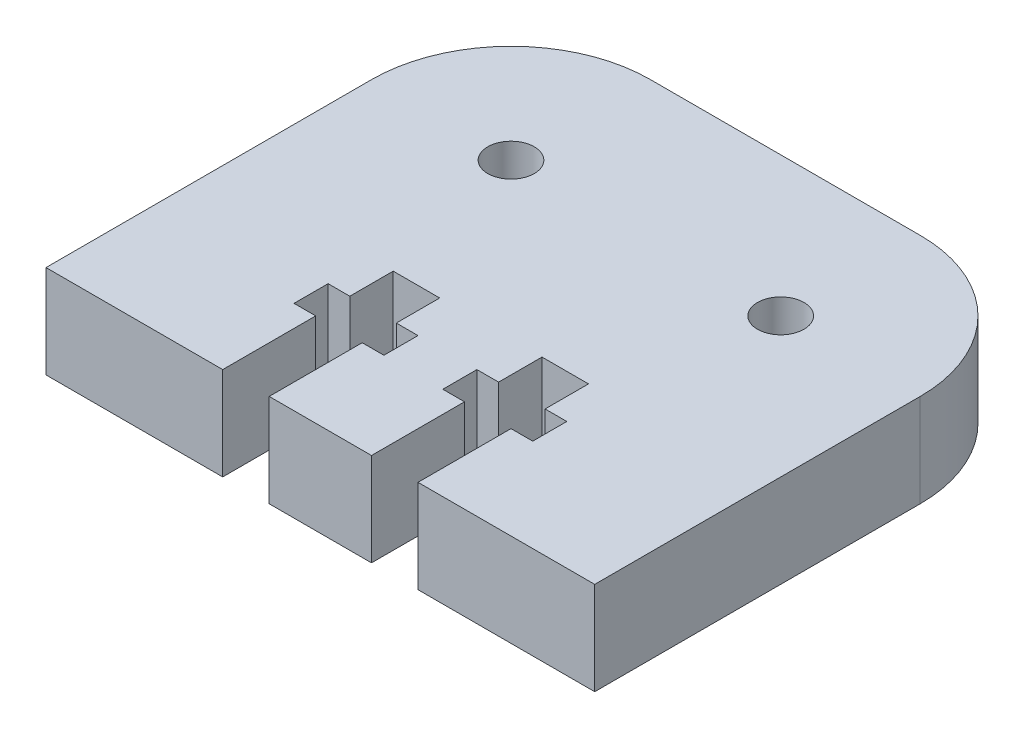
ISO-10303-21;
HEADER;
FILE_DESCRIPTION(('STEP AP214'),'2;1');
FILE_NAME('part.step','',(''),(''),'','','');
FILE_SCHEMA(('AUTOMOTIVE_DESIGN { 1 0 10303 214 1 1 1 1 }'));
ENDSEC;
DATA;
#1=APPLICATION_CONTEXT('core data for automotive mechanical design processes');
#2=APPLICATION_PROTOCOL_DEFINITION('international standard','automotive_design',2000,#1);
#3=PRODUCT_CONTEXT('',#1,'mechanical');
#4=PRODUCT('Part','Part','',(#3));
#5=PRODUCT_RELATED_PRODUCT_CATEGORY('part','',(#4));
#6=PRODUCT_DEFINITION_FORMATION('','',#4);
#7=PRODUCT_DEFINITION_CONTEXT('part definition',#1,'design');
#8=PRODUCT_DEFINITION('design','',#6,#7);
#9=PRODUCT_DEFINITION_SHAPE('','',#8);
#10=(LENGTH_UNIT() NAMED_UNIT(*) SI_UNIT(.MILLI.,.METRE.));
#11=(NAMED_UNIT(*) PLANE_ANGLE_UNIT() SI_UNIT($,.RADIAN.));
#12=(NAMED_UNIT(*) SI_UNIT($,.STERADIAN.) SOLID_ANGLE_UNIT());
#13=UNCERTAINTY_MEASURE_WITH_UNIT(LENGTH_MEASURE(1.E-05),#10,'distance_accuracy_value','');
#14=(GEOMETRIC_REPRESENTATION_CONTEXT(3) GLOBAL_UNCERTAINTY_ASSIGNED_CONTEXT((#13)) GLOBAL_UNIT_ASSIGNED_CONTEXT((#10,
#11,#12)) REPRESENTATION_CONTEXT('',''));
#15=CARTESIAN_POINT('',(0.,0.,0.));
#16=DIRECTION('',(0.,0.,1.));
#17=DIRECTION('',(1.,0.,0.));
#18=AXIS2_PLACEMENT_3D('',#15,#16,#17);
#19=CARTESIAN_POINT('',(0.,6.,0.));
#20=DIRECTION('',(0.,-1.,0.));
#21=DIRECTION('',(0.,0.,-1.));
#22=AXIS2_PLACEMENT_3D('',#19,#20,#21);
#23=PLANE('',#22);
#24=DIRECTION('',(0.,0.,1.));
#25=VECTOR('',#24,1.);
#26=CARTESIAN_POINT('',(17.7,6.,-15.));
#27=LINE('',#26,#25);
#28=CARTESIAN_POINT('',(17.7,6.,-6.));
#29=VERTEX_POINT('',#28);
#30=CARTESIAN_POINT('',(17.7,6.,15.));
#31=VERTEX_POINT('',#30);
#32=EDGE_CURVE('E229',#29,#31,#27,.T.);
#33=ORIENTED_EDGE('',*,*,#32,.F.);
#34=CARTESIAN_POINT('',(8.7,6.,-6.));
#35=DIRECTION('',(0.,-1.,0.));
#36=DIRECTION('',(0.,0.,-1.));
#37=AXIS2_PLACEMENT_3D('',#34,#35,#36);
#38=CIRCLE('',#37,9.);
#39=CARTESIAN_POINT('',(8.7,6.,-15.));
#40=VERTEX_POINT('',#39);
#41=EDGE_CURVE('E40',#29,#40,#38,.F.);
#42=ORIENTED_EDGE('',*,*,#41,.T.);
#43=DIRECTION('',(-1.,0.,0.));
#44=VECTOR('',#43,1.);
#45=CARTESIAN_POINT('',(-17.7,6.,-15.));
#46=LINE('',#45,#44);
#47=CARTESIAN_POINT('',(-8.70000000000001,6.,-15.));
#48=VERTEX_POINT('',#47);
#49=EDGE_CURVE('E354',#40,#48,#46,.T.);
#50=ORIENTED_EDGE('',*,*,#49,.T.);
#51=CARTESIAN_POINT('',(-8.70000000000001,6.,-6.));
#52=DIRECTION('',(0.,-1.,0.));
#53=DIRECTION('',(0.,0.,-1.));
#54=AXIS2_PLACEMENT_3D('',#51,#52,#53);
#55=CIRCLE('',#54,9.);
#56=CARTESIAN_POINT('',(-17.7,6.,-5.99999999999999));
#57=VERTEX_POINT('',#56);
#58=EDGE_CURVE('E47',#48,#57,#55,.F.);
#59=ORIENTED_EDGE('',*,*,#58,.T.);
#60=DIRECTION('',(0.,0.,1.));
#61=VECTOR('',#60,1.);
#62=CARTESIAN_POINT('',(-17.7,6.,-15.));
#63=LINE('',#62,#61);
#64=CARTESIAN_POINT('',(-17.7,6.,15.));
#65=VERTEX_POINT('',#64);
#66=EDGE_CURVE('E357',#57,#65,#63,.T.);
#67=ORIENTED_EDGE('',*,*,#66,.T.);
#68=DIRECTION('',(1.,0.,0.));
#69=VECTOR('',#68,1.);
#70=CARTESIAN_POINT('',(-17.7,6.,15.));
#71=LINE('',#70,#69);
#72=CARTESIAN_POINT('',(-6.3,6.,15.));
#73=VERTEX_POINT('',#72);
#74=EDGE_CURVE('E359',#65,#73,#71,.T.);
#75=ORIENTED_EDGE('',*,*,#74,.T.);
#76=DIRECTION('',(0.,0.,-1.));
#77=VECTOR('',#76,1.);
#78=CARTESIAN_POINT('',(-6.3,6.,9.));
#79=LINE('',#78,#77);
#80=CARTESIAN_POINT('',(-6.3,6.,9.));
#81=VERTEX_POINT('',#80);
#82=EDGE_CURVE('E361',#73,#81,#79,.T.);
#83=ORIENTED_EDGE('',*,*,#82,.T.);
#84=DIRECTION('',(-1.,0.,0.));
#85=VECTOR('',#84,1.);
#86=CARTESIAN_POINT('',(-7.7,6.,9.));
#87=LINE('',#86,#85);
#88=CARTESIAN_POINT('',(-7.7,6.,9.));
#89=VERTEX_POINT('',#88);
#90=EDGE_CURVE('E363',#81,#89,#87,.T.);
#91=ORIENTED_EDGE('',*,*,#90,.T.);
#92=DIRECTION('',(0.,0.,-1.));
#93=VECTOR('',#92,1.);
#94=CARTESIAN_POINT('',(-7.7,6.,9.));
#95=LINE('',#94,#93);
#96=CARTESIAN_POINT('',(-7.7,6.,6.8));
#97=VERTEX_POINT('',#96);
#98=EDGE_CURVE('E365',#89,#97,#95,.T.);
#99=ORIENTED_EDGE('',*,*,#98,.T.);
#100=DIRECTION('',(1.,0.,0.));
#101=VECTOR('',#100,1.);
#102=CARTESIAN_POINT('',(-7.7,6.,6.8));
#103=LINE('',#102,#101);
#104=CARTESIAN_POINT('',(-6.3,6.,6.8));
#105=VERTEX_POINT('',#104);
#106=EDGE_CURVE('E367',#97,#105,#103,.T.);
#107=ORIENTED_EDGE('',*,*,#106,.T.);
#108=DIRECTION('',(0.,0.,-1.));
#109=VECTOR('',#108,1.);
#110=CARTESIAN_POINT('',(-6.3,6.,4.));
#111=LINE('',#110,#109);
#112=CARTESIAN_POINT('',(-6.3,6.,4.));
#113=VERTEX_POINT('',#112);
#114=EDGE_CURVE('E369',#105,#113,#111,.T.);
#115=ORIENTED_EDGE('',*,*,#114,.T.);
#116=DIRECTION('',(1.,0.,0.));
#117=VECTOR('',#116,1.);
#118=CARTESIAN_POINT('',(-6.3,6.,4.));
#119=LINE('',#118,#117);
#120=CARTESIAN_POINT('',(-3.3,6.,4.));
#121=VERTEX_POINT('',#120);
#122=EDGE_CURVE('E371',#113,#121,#119,.T.);
#123=ORIENTED_EDGE('',*,*,#122,.T.);
#124=DIRECTION('',(0.,0.,1.));
#125=VECTOR('',#124,1.);
#126=CARTESIAN_POINT('',(-3.3,6.,4.));
#127=LINE('',#126,#125);
#128=CARTESIAN_POINT('',(-3.3,6.,6.8));
#129=VERTEX_POINT('',#128);
#130=EDGE_CURVE('E373',#121,#129,#127,.T.);
#131=ORIENTED_EDGE('',*,*,#130,.T.);
#132=DIRECTION('',(1.,0.,0.));
#133=VECTOR('',#132,1.);
#134=CARTESIAN_POINT('',(-3.3,6.,6.8));
#135=LINE('',#134,#133);
#136=CARTESIAN_POINT('',(-1.9,6.,6.8));
#137=VERTEX_POINT('',#136);
#138=EDGE_CURVE('E375',#129,#137,#135,.T.);
#139=ORIENTED_EDGE('',*,*,#138,.T.);
#140=DIRECTION('',(0.,0.,1.));
#141=VECTOR('',#140,1.);
#142=CARTESIAN_POINT('',(-1.9,6.,9.));
#143=LINE('',#142,#141);
#144=CARTESIAN_POINT('',(-1.9,6.,9.));
#145=VERTEX_POINT('',#144);
#146=EDGE_CURVE('E377',#137,#145,#143,.T.);
#147=ORIENTED_EDGE('',*,*,#146,.T.);
#148=DIRECTION('',(-1.,0.,0.));
#149=VECTOR('',#148,1.);
#150=CARTESIAN_POINT('',(-3.3,6.,9.));
#151=LINE('',#150,#149);
#152=CARTESIAN_POINT('',(-3.3,6.,9.));
#153=VERTEX_POINT('',#152);
#154=EDGE_CURVE('E379',#145,#153,#151,.T.);
#155=ORIENTED_EDGE('',*,*,#154,.T.);
#156=DIRECTION('',(0.,0.,1.));
#157=VECTOR('',#156,1.);
#158=CARTESIAN_POINT('',(-3.3,6.,9.));
#159=LINE('',#158,#157);
#160=CARTESIAN_POINT('',(-3.3,6.,15.));
#161=VERTEX_POINT('',#160);
#162=EDGE_CURVE('E381',#153,#161,#159,.T.);
#163=ORIENTED_EDGE('',*,*,#162,.T.);
#164=DIRECTION('',(1.,0.,0.));
#165=VECTOR('',#164,1.);
#166=CARTESIAN_POINT('',(-3.3,6.,15.));
#167=LINE('',#166,#165);
#168=CARTESIAN_POINT('',(3.30000000000001,6.,15.));
#169=VERTEX_POINT('',#168);
#170=EDGE_CURVE('E352',#161,#169,#167,.T.);
#171=ORIENTED_EDGE('',*,*,#170,.T.);
#172=DIRECTION('',(0.,0.,1.));
#173=VECTOR('',#172,1.);
#174=CARTESIAN_POINT('',(3.30000000000001,6.,9.));
#175=LINE('',#174,#173);
#176=CARTESIAN_POINT('',(3.30000000000001,6.,9.));
#177=VERTEX_POINT('',#176);
#178=EDGE_CURVE('E283',#177,#169,#175,.T.);
#179=ORIENTED_EDGE('',*,*,#178,.F.);
#180=DIRECTION('',(1.,0.,0.));
#181=VECTOR('',#180,1.);
#182=CARTESIAN_POINT('',(3.30000000000001,6.,9.));
#183=LINE('',#182,#181);
#184=CARTESIAN_POINT('',(1.90000000000001,6.,9.));
#185=VERTEX_POINT('',#184);
#186=EDGE_CURVE('E280',#185,#177,#183,.T.);
#187=ORIENTED_EDGE('',*,*,#186,.F.);
#188=DIRECTION('',(0.,0.,1.));
#189=VECTOR('',#188,1.);
#190=CARTESIAN_POINT('',(1.90000000000001,6.,9.));
#191=LINE('',#190,#189);
#192=CARTESIAN_POINT('',(1.90000000000001,6.,6.8));
#193=VERTEX_POINT('',#192);
#194=EDGE_CURVE('E277',#193,#185,#191,.T.);
#195=ORIENTED_EDGE('',*,*,#194,.F.);
#196=DIRECTION('',(-1.,0.,0.));
#197=VECTOR('',#196,1.);
#198=CARTESIAN_POINT('',(3.30000000000001,6.,6.8));
#199=LINE('',#198,#197);
#200=CARTESIAN_POINT('',(3.30000000000001,6.,6.8));
#201=VERTEX_POINT('',#200);
#202=EDGE_CURVE('E274',#201,#193,#199,.T.);
#203=ORIENTED_EDGE('',*,*,#202,.F.);
#204=DIRECTION('',(0.,0.,1.));
#205=VECTOR('',#204,1.);
#206=CARTESIAN_POINT('',(3.30000000000001,6.,4.));
#207=LINE('',#206,#205);
#208=CARTESIAN_POINT('',(3.30000000000001,6.,4.));
#209=VERTEX_POINT('',#208);
#210=EDGE_CURVE('E271',#209,#201,#207,.T.);
#211=ORIENTED_EDGE('',*,*,#210,.F.);
#212=DIRECTION('',(-1.,0.,0.));
#213=VECTOR('',#212,1.);
#214=CARTESIAN_POINT('',(6.30000000000001,6.,4.));
#215=LINE('',#214,#213);
#216=CARTESIAN_POINT('',(6.30000000000001,6.,4.));
#217=VERTEX_POINT('',#216);
#218=EDGE_CURVE('E268',#217,#209,#215,.T.);
#219=ORIENTED_EDGE('',*,*,#218,.F.);
#220=DIRECTION('',(0.,0.,-1.));
#221=VECTOR('',#220,1.);
#222=CARTESIAN_POINT('',(6.30000000000001,6.,4.));
#223=LINE('',#222,#221);
#224=CARTESIAN_POINT('',(6.30000000000001,6.,6.8));
#225=VERTEX_POINT('',#224);
#226=EDGE_CURVE('E265',#225,#217,#223,.T.);
#227=ORIENTED_EDGE('',*,*,#226,.F.);
#228=DIRECTION('',(-1.,0.,0.));
#229=VECTOR('',#228,1.);
#230=CARTESIAN_POINT('',(7.70000000000001,6.,6.8));
#231=LINE('',#230,#229);
#232=CARTESIAN_POINT('',(7.70000000000001,6.,6.8));
#233=VERTEX_POINT('',#232);
#234=EDGE_CURVE('E262',#233,#225,#231,.T.);
#235=ORIENTED_EDGE('',*,*,#234,.F.);
#236=DIRECTION('',(0.,0.,-1.));
#237=VECTOR('',#236,1.);
#238=CARTESIAN_POINT('',(7.70000000000001,6.,9.));
#239=LINE('',#238,#237);
#240=CARTESIAN_POINT('',(7.70000000000001,6.,9.));
#241=VERTEX_POINT('',#240);
#242=EDGE_CURVE('E259',#241,#233,#239,.T.);
#243=ORIENTED_EDGE('',*,*,#242,.F.);
#244=DIRECTION('',(1.,0.,0.));
#245=VECTOR('',#244,1.);
#246=CARTESIAN_POINT('',(7.70000000000001,6.,9.));
#247=LINE('',#246,#245);
#248=CARTESIAN_POINT('',(6.30000000000001,6.,9.));
#249=VERTEX_POINT('',#248);
#250=EDGE_CURVE('E253',#249,#241,#247,.T.);
#251=ORIENTED_EDGE('',*,*,#250,.F.);
#252=DIRECTION('',(0.,0.,-1.));
#253=VECTOR('',#252,1.);
#254=CARTESIAN_POINT('',(6.30000000000001,6.,9.));
#255=LINE('',#254,#253);
#256=CARTESIAN_POINT('',(6.30000000000001,6.,15.));
#257=VERTEX_POINT('',#256);
#258=EDGE_CURVE('E251',#257,#249,#255,.T.);
#259=ORIENTED_EDGE('',*,*,#258,.F.);
#260=DIRECTION('',(-1.,0.,0.));
#261=VECTOR('',#260,1.);
#262=CARTESIAN_POINT('',(17.7,6.,15.));
#263=LINE('',#262,#261);
#264=EDGE_CURVE('E236',#31,#257,#263,.T.);
#265=ORIENTED_EDGE('',*,*,#264,.F.);
#266=EDGE_LOOP('',(#33,#42,#50,#59,#67,#75,#83,#91,#99,#107,#115,#123,#131,#139,#147,#155,#163,
#171,#179,#187,#195,#203,#211,#219,#227,#235,#243,#251,#259,#265));
#267=FACE_BOUND('',#266,.T.);
#268=CARTESIAN_POINT('',(-8.7,6.,-6.));
#269=DIRECTION('',(0.,1.,0.));
#270=DIRECTION('',(0.,0.,1.));
#271=AXIS2_PLACEMENT_3D('',#268,#269,#270);
#272=CIRCLE('',#271,1.5);
#273=CARTESIAN_POINT('',(-8.7,6.,-4.49999999999999));
#274=VERTEX_POINT('',#273);
#275=EDGE_CURVE('E346',#274,#274,#272,.T.);
#276=ORIENTED_EDGE('',*,*,#275,.F.);
#277=EDGE_LOOP('',(#276));
#278=FACE_BOUND('',#277,.T.);
#279=CARTESIAN_POINT('',(8.7,6.,-6.));
#280=DIRECTION('',(0.,-1.,0.));
#281=DIRECTION('',(0.,0.,1.));
#282=AXIS2_PLACEMENT_3D('',#279,#280,#281);
#283=CIRCLE('',#282,1.5);
#284=CARTESIAN_POINT('',(8.7,6.,-4.5));
#285=VERTEX_POINT('',#284);
#286=EDGE_CURVE('E289',#285,#285,#283,.T.);
#287=ORIENTED_EDGE('',*,*,#286,.T.);
#288=EDGE_LOOP('',(#287));
#289=FACE_BOUND('',#288,.T.);
#290=ADVANCED_FACE('F32',(#267,#278,#289),#23,.F.);
#291=CARTESIAN_POINT('',(0.,0.,0.));
#292=DIRECTION('',(0.,-1.,0.));
#293=DIRECTION('',(0.,0.,-1.));
#294=AXIS2_PLACEMENT_3D('',#291,#292,#293);
#295=PLANE('',#294);
#296=DIRECTION('',(-1.,0.,0.));
#297=VECTOR('',#296,1.);
#298=CARTESIAN_POINT('',(-17.7,0.,-15.));
#299=LINE('',#298,#297);
#300=CARTESIAN_POINT('',(8.7,0.,-15.));
#301=VERTEX_POINT('',#300);
#302=CARTESIAN_POINT('',(-8.70000000000001,0.,-15.));
#303=VERTEX_POINT('',#302);
#304=EDGE_CURVE('E385',#301,#303,#299,.T.);
#305=ORIENTED_EDGE('',*,*,#304,.F.);
#306=CARTESIAN_POINT('',(8.7,0.,-6.));
#307=DIRECTION('',(0.,-1.,0.));
#308=DIRECTION('',(0.,0.,-1.));
#309=AXIS2_PLACEMENT_3D('',#306,#307,#308);
#310=CIRCLE('',#309,9.);
#311=CARTESIAN_POINT('',(17.7,0.,-6.));
#312=VERTEX_POINT('',#311);
#313=EDGE_CURVE('E458',#301,#312,#310,.T.);
#314=ORIENTED_EDGE('',*,*,#313,.T.);
#315=DIRECTION('',(0.,0.,1.));
#316=VECTOR('',#315,1.);
#317=CARTESIAN_POINT('',(17.7,0.,-15.));
#318=LINE('',#317,#316);
#319=CARTESIAN_POINT('',(17.7,0.,15.));
#320=VERTEX_POINT('',#319);
#321=EDGE_CURVE('E287',#312,#320,#318,.T.);
#322=ORIENTED_EDGE('',*,*,#321,.T.);
#323=DIRECTION('',(-1.,0.,0.));
#324=VECTOR('',#323,1.);
#325=CARTESIAN_POINT('',(17.7,0.,15.));
#326=LINE('',#325,#324);
#327=CARTESIAN_POINT('',(6.30000000000001,0.,15.));
#328=VERTEX_POINT('',#327);
#329=EDGE_CURVE('E244',#320,#328,#326,.T.);
#330=ORIENTED_EDGE('',*,*,#329,.T.);
#331=DIRECTION('',(0.,0.,-1.));
#332=VECTOR('',#331,1.);
#333=CARTESIAN_POINT('',(6.30000000000001,0.,9.));
#334=LINE('',#333,#332);
#335=CARTESIAN_POINT('',(6.30000000000001,0.,9.));
#336=VERTEX_POINT('',#335);
#337=EDGE_CURVE('E291',#328,#336,#334,.T.);
#338=ORIENTED_EDGE('',*,*,#337,.T.);
#339=DIRECTION('',(1.,0.,0.));
#340=VECTOR('',#339,1.);
#341=CARTESIAN_POINT('',(7.70000000000001,0.,9.));
#342=LINE('',#341,#340);
#343=CARTESIAN_POINT('',(7.70000000000001,0.,9.));
#344=VERTEX_POINT('',#343);
#345=EDGE_CURVE('E294',#336,#344,#342,.T.);
#346=ORIENTED_EDGE('',*,*,#345,.T.);
#347=DIRECTION('',(0.,0.,-1.));
#348=VECTOR('',#347,1.);
#349=CARTESIAN_POINT('',(7.70000000000001,0.,9.));
#350=LINE('',#349,#348);
#351=CARTESIAN_POINT('',(7.70000000000001,0.,6.8));
#352=VERTEX_POINT('',#351);
#353=EDGE_CURVE('E297',#344,#352,#350,.T.);
#354=ORIENTED_EDGE('',*,*,#353,.T.);
#355=DIRECTION('',(-1.,0.,0.));
#356=VECTOR('',#355,1.);
#357=CARTESIAN_POINT('',(7.70000000000001,0.,6.8));
#358=LINE('',#357,#356);
#359=CARTESIAN_POINT('',(6.30000000000001,0.,6.8));
#360=VERTEX_POINT('',#359);
#361=EDGE_CURVE('E300',#352,#360,#358,.T.);
#362=ORIENTED_EDGE('',*,*,#361,.T.);
#363=DIRECTION('',(0.,0.,-1.));
#364=VECTOR('',#363,1.);
#365=CARTESIAN_POINT('',(6.30000000000001,0.,4.));
#366=LINE('',#365,#364);
#367=CARTESIAN_POINT('',(6.30000000000001,0.,4.));
#368=VERTEX_POINT('',#367);
#369=EDGE_CURVE('E303',#360,#368,#366,.T.);
#370=ORIENTED_EDGE('',*,*,#369,.T.);
#371=DIRECTION('',(-1.,0.,0.));
#372=VECTOR('',#371,1.);
#373=CARTESIAN_POINT('',(6.30000000000001,0.,4.));
#374=LINE('',#373,#372);
#375=CARTESIAN_POINT('',(3.30000000000001,0.,4.));
#376=VERTEX_POINT('',#375);
#377=EDGE_CURVE('E306',#368,#376,#374,.T.);
#378=ORIENTED_EDGE('',*,*,#377,.T.);
#379=DIRECTION('',(0.,0.,1.));
#380=VECTOR('',#379,1.);
#381=CARTESIAN_POINT('',(3.30000000000001,0.,4.));
#382=LINE('',#381,#380);
#383=CARTESIAN_POINT('',(3.30000000000001,0.,6.8));
#384=VERTEX_POINT('',#383);
#385=EDGE_CURVE('E309',#376,#384,#382,.T.);
#386=ORIENTED_EDGE('',*,*,#385,.T.);
#387=DIRECTION('',(-1.,0.,0.));
#388=VECTOR('',#387,1.);
#389=CARTESIAN_POINT('',(3.30000000000001,0.,6.8));
#390=LINE('',#389,#388);
#391=CARTESIAN_POINT('',(1.90000000000001,0.,6.8));
#392=VERTEX_POINT('',#391);
#393=EDGE_CURVE('E312',#384,#392,#390,.T.);
#394=ORIENTED_EDGE('',*,*,#393,.T.);
#395=DIRECTION('',(0.,0.,1.));
#396=VECTOR('',#395,1.);
#397=CARTESIAN_POINT('',(1.90000000000001,0.,9.));
#398=LINE('',#397,#396);
#399=CARTESIAN_POINT('',(1.90000000000001,0.,9.));
#400=VERTEX_POINT('',#399);
#401=EDGE_CURVE('E315',#392,#400,#398,.T.);
#402=ORIENTED_EDGE('',*,*,#401,.T.);
#403=DIRECTION('',(1.,0.,0.));
#404=VECTOR('',#403,1.);
#405=CARTESIAN_POINT('',(3.30000000000001,0.,9.));
#406=LINE('',#405,#404);
#407=CARTESIAN_POINT('',(3.30000000000001,0.,9.));
#408=VERTEX_POINT('',#407);
#409=EDGE_CURVE('E318',#400,#408,#406,.T.);
#410=ORIENTED_EDGE('',*,*,#409,.T.);
#411=DIRECTION('',(0.,0.,1.));
#412=VECTOR('',#411,1.);
#413=CARTESIAN_POINT('',(3.30000000000001,0.,9.));
#414=LINE('',#413,#412);
#415=CARTESIAN_POINT('',(3.30000000000001,0.,15.));
#416=VERTEX_POINT('',#415);
#417=EDGE_CURVE('E237',#408,#416,#414,.T.);
#418=ORIENTED_EDGE('',*,*,#417,.T.);
#419=DIRECTION('',(1.,0.,0.));
#420=VECTOR('',#419,1.);
#421=CARTESIAN_POINT('',(-3.3,0.,15.));
#422=LINE('',#421,#420);
#423=CARTESIAN_POINT('',(-3.3,0.,15.));
#424=VERTEX_POINT('',#423);
#425=EDGE_CURVE('E349',#424,#416,#422,.T.);
#426=ORIENTED_EDGE('',*,*,#425,.F.);
#427=DIRECTION('',(0.,0.,1.));
#428=VECTOR('',#427,1.);
#429=CARTESIAN_POINT('',(-3.3,0.,9.));
#430=LINE('',#429,#428);
#431=CARTESIAN_POINT('',(-3.3,0.,9.));
#432=VERTEX_POINT('',#431);
#433=EDGE_CURVE('E355',#432,#424,#430,.T.);
#434=ORIENTED_EDGE('',*,*,#433,.F.);
#435=DIRECTION('',(-1.,0.,0.));
#436=VECTOR('',#435,1.);
#437=CARTESIAN_POINT('',(-3.3,0.,9.));
#438=LINE('',#437,#436);
#439=CARTESIAN_POINT('',(-1.9,0.,9.));
#440=VERTEX_POINT('',#439);
#441=EDGE_CURVE('E410',#440,#432,#438,.T.);
#442=ORIENTED_EDGE('',*,*,#441,.F.);
#443=DIRECTION('',(0.,0.,1.));
#444=VECTOR('',#443,1.);
#445=CARTESIAN_POINT('',(-1.9,0.,9.));
#446=LINE('',#445,#444);
#447=CARTESIAN_POINT('',(-1.9,0.,6.8));
#448=VERTEX_POINT('',#447);
#449=EDGE_CURVE('E408',#448,#440,#446,.T.);
#450=ORIENTED_EDGE('',*,*,#449,.F.);
#451=DIRECTION('',(1.,0.,0.));
#452=VECTOR('',#451,1.);
#453=CARTESIAN_POINT('',(-3.3,0.,6.8));
#454=LINE('',#453,#452);
#455=CARTESIAN_POINT('',(-3.3,0.,6.8));
#456=VERTEX_POINT('',#455);
#457=EDGE_CURVE('E406',#456,#448,#454,.T.);
#458=ORIENTED_EDGE('',*,*,#457,.F.);
#459=DIRECTION('',(0.,0.,1.));
#460=VECTOR('',#459,1.);
#461=CARTESIAN_POINT('',(-3.3,0.,4.));
#462=LINE('',#461,#460);
#463=CARTESIAN_POINT('',(-3.3,0.,4.));
#464=VERTEX_POINT('',#463);
#465=EDGE_CURVE('E404',#464,#456,#462,.T.);
#466=ORIENTED_EDGE('',*,*,#465,.F.);
#467=DIRECTION('',(1.,0.,0.));
#468=VECTOR('',#467,1.);
#469=CARTESIAN_POINT('',(-6.3,0.,4.));
#470=LINE('',#469,#468);
#471=CARTESIAN_POINT('',(-6.3,0.,4.));
#472=VERTEX_POINT('',#471);
#473=EDGE_CURVE('E402',#472,#464,#470,.T.);
#474=ORIENTED_EDGE('',*,*,#473,.F.);
#475=DIRECTION('',(0.,0.,-1.));
#476=VECTOR('',#475,1.);
#477=CARTESIAN_POINT('',(-6.3,0.,4.));
#478=LINE('',#477,#476);
#479=CARTESIAN_POINT('',(-6.3,0.,6.8));
#480=VERTEX_POINT('',#479);
#481=EDGE_CURVE('E400',#480,#472,#478,.T.);
#482=ORIENTED_EDGE('',*,*,#481,.F.);
#483=DIRECTION('',(1.,0.,0.));
#484=VECTOR('',#483,1.);
#485=CARTESIAN_POINT('',(-7.7,0.,6.8));
#486=LINE('',#485,#484);
#487=CARTESIAN_POINT('',(-7.7,0.,6.8));
#488=VERTEX_POINT('',#487);
#489=EDGE_CURVE('E398',#488,#480,#486,.T.);
#490=ORIENTED_EDGE('',*,*,#489,.F.);
#491=DIRECTION('',(0.,0.,-1.));
#492=VECTOR('',#491,1.);
#493=CARTESIAN_POINT('',(-7.7,0.,9.));
#494=LINE('',#493,#492);
#495=CARTESIAN_POINT('',(-7.7,0.,9.));
#496=VERTEX_POINT('',#495);
#497=EDGE_CURVE('E396',#496,#488,#494,.T.);
#498=ORIENTED_EDGE('',*,*,#497,.F.);
#499=DIRECTION('',(-1.,0.,0.));
#500=VECTOR('',#499,1.);
#501=CARTESIAN_POINT('',(-7.7,0.,9.));
#502=LINE('',#501,#500);
#503=CARTESIAN_POINT('',(-6.3,0.,9.));
#504=VERTEX_POINT('',#503);
#505=EDGE_CURVE('E394',#504,#496,#502,.T.);
#506=ORIENTED_EDGE('',*,*,#505,.F.);
#507=DIRECTION('',(0.,0.,-1.));
#508=VECTOR('',#507,1.);
#509=CARTESIAN_POINT('',(-6.3,0.,9.));
#510=LINE('',#509,#508);
#511=CARTESIAN_POINT('',(-6.3,0.,15.));
#512=VERTEX_POINT('',#511);
#513=EDGE_CURVE('E392',#512,#504,#510,.T.);
#514=ORIENTED_EDGE('',*,*,#513,.F.);
#515=DIRECTION('',(1.,0.,0.));
#516=VECTOR('',#515,1.);
#517=CARTESIAN_POINT('',(-17.7,0.,15.));
#518=LINE('',#517,#516);
#519=CARTESIAN_POINT('',(-17.7,0.,15.));
#520=VERTEX_POINT('',#519);
#521=EDGE_CURVE('E390',#520,#512,#518,.T.);
#522=ORIENTED_EDGE('',*,*,#521,.F.);
#523=DIRECTION('',(0.,0.,1.));
#524=VECTOR('',#523,1.);
#525=CARTESIAN_POINT('',(-17.7,0.,-15.));
#526=LINE('',#525,#524);
#527=CARTESIAN_POINT('',(-17.7,0.,-5.99999999999999));
#528=VERTEX_POINT('',#527);
#529=EDGE_CURVE('E388',#528,#520,#526,.T.);
#530=ORIENTED_EDGE('',*,*,#529,.F.);
#531=CARTESIAN_POINT('',(-8.70000000000001,0.,-6.));
#532=DIRECTION('',(0.,-1.,0.));
#533=DIRECTION('',(0.,0.,-1.));
#534=AXIS2_PLACEMENT_3D('',#531,#532,#533);
#535=CIRCLE('',#534,9.);
#536=EDGE_CURVE('E456',#528,#303,#535,.T.);
#537=ORIENTED_EDGE('',*,*,#536,.T.);
#538=EDGE_LOOP('',(#305,#314,#322,#330,#338,#346,#354,#362,#370,#378,#386,#394,#402,#410,#418,
#426,#434,#442,#450,#458,#466,#474,#482,#490,#498,#506,#514,#522,#530,#537));
#539=FACE_BOUND('',#538,.T.);
#540=CARTESIAN_POINT('',(-8.7,0.,-6.));
#541=DIRECTION('',(0.,1.,0.));
#542=DIRECTION('',(0.,0.,1.));
#543=AXIS2_PLACEMENT_3D('',#540,#541,#542);
#544=CIRCLE('',#543,1.5);
#545=CARTESIAN_POINT('',(-8.7,0.,-4.49999999999999));
#546=VERTEX_POINT('',#545);
#547=EDGE_CURVE('E245',#546,#546,#544,.T.);
#548=ORIENTED_EDGE('',*,*,#547,.T.);
#549=EDGE_LOOP('',(#548));
#550=FACE_BOUND('',#549,.T.);
#551=CARTESIAN_POINT('',(8.7,0.,-6.));
#552=DIRECTION('',(0.,-1.,0.));
#553=DIRECTION('',(0.,0.,1.));
#554=AXIS2_PLACEMENT_3D('',#551,#552,#553);
#555=CIRCLE('',#554,1.5);
#556=CARTESIAN_POINT('',(8.7,0.,-4.5));
#557=VERTEX_POINT('',#556);
#558=EDGE_CURVE('E871',#557,#557,#555,.T.);
#559=ORIENTED_EDGE('',*,*,#558,.F.);
#560=EDGE_LOOP('',(#559));
#561=FACE_BOUND('',#560,.T.);
#562=ADVANCED_FACE('F470',(#539,#550,#561),#295,.T.);
#563=CARTESIAN_POINT('',(-3.3,6.,15.));
#564=DIRECTION('',(0.,0.,-1.));
#565=DIRECTION('',(-1.,0.,0.));
#566=AXIS2_PLACEMENT_3D('',#563,#564,#565);
#567=PLANE('',#566);
#568=ORIENTED_EDGE('',*,*,#425,.T.);
#569=DIRECTION('',(0.,-1.,0.));
#570=VECTOR('',#569,1.);
#571=CARTESIAN_POINT('',(3.30000000000001,6.,15.));
#572=LINE('',#571,#570);
#573=EDGE_CURVE('E286',#169,#416,#572,.T.);
#574=ORIENTED_EDGE('',*,*,#573,.F.);
#575=ORIENTED_EDGE('',*,*,#170,.F.);
#576=DIRECTION('',(0.,-1.,0.));
#577=VECTOR('',#576,1.);
#578=CARTESIAN_POINT('',(-3.3,6.,15.));
#579=LINE('',#578,#577);
#580=EDGE_CURVE('E383',#161,#424,#579,.T.);
#581=ORIENTED_EDGE('',*,*,#580,.T.);
#582=EDGE_LOOP('',(#568,#574,#575,#581));
#583=FACE_BOUND('',#582,.T.);
#584=ADVANCED_FACE('F543',(#583),#567,.F.);
#585=CARTESIAN_POINT('',(-17.7,6.,-15.));
#586=DIRECTION('',(0.,0.,1.));
#587=DIRECTION('',(1.,0.,0.));
#588=AXIS2_PLACEMENT_3D('',#585,#586,#587);
#589=PLANE('',#588);
#590=ORIENTED_EDGE('',*,*,#49,.F.);
#591=DIRECTION('',(0.,-1.,0.));
#592=VECTOR('',#591,1.);
#593=CARTESIAN_POINT('',(8.7,6.,-15.));
#594=LINE('',#593,#592);
#595=EDGE_CURVE('E453',#40,#301,#594,.T.);
#596=ORIENTED_EDGE('',*,*,#595,.T.);
#597=ORIENTED_EDGE('',*,*,#304,.T.);
#598=DIRECTION('',(0.,-1.,0.));
#599=VECTOR('',#598,1.);
#600=CARTESIAN_POINT('',(-8.70000000000001,6.,-15.));
#601=LINE('',#600,#599);
#602=EDGE_CURVE('E451',#303,#48,#601,.F.);
#603=ORIENTED_EDGE('',*,*,#602,.T.);
#604=EDGE_LOOP('',(#590,#596,#597,#603));
#605=FACE_BOUND('',#604,.T.);
#606=ADVANCED_FACE('F465',(#605),#589,.F.);
#607=CARTESIAN_POINT('',(-17.7,6.,-15.));
#608=DIRECTION('',(1.,0.,0.));
#609=DIRECTION('',(0.,0.,-1.));
#610=AXIS2_PLACEMENT_3D('',#607,#608,#609);
#611=PLANE('',#610);
#612=ORIENTED_EDGE('',*,*,#66,.F.);
#613=DIRECTION('',(0.,-1.,0.));
#614=VECTOR('',#613,1.);
#615=CARTESIAN_POINT('',(-17.7,6.,-5.99999999999999));
#616=LINE('',#615,#614);
#617=EDGE_CURVE('E11',#57,#528,#616,.T.);
#618=ORIENTED_EDGE('',*,*,#617,.T.);
#619=ORIENTED_EDGE('',*,*,#529,.T.);
#620=DIRECTION('',(0.,-1.,0.));
#621=VECTOR('',#620,1.);
#622=CARTESIAN_POINT('',(-17.7,6.,15.));
#623=LINE('',#622,#621);
#624=EDGE_CURVE('E448',#65,#520,#623,.T.);
#625=ORIENTED_EDGE('',*,*,#624,.F.);
#626=EDGE_LOOP('',(#612,#618,#619,#625));
#627=FACE_BOUND('',#626,.T.);
#628=ADVANCED_FACE('F476',(#627),#611,.F.);
#629=CARTESIAN_POINT('',(-17.7,6.,15.));
#630=DIRECTION('',(0.,0.,-1.));
#631=DIRECTION('',(-1.,0.,0.));
#632=AXIS2_PLACEMENT_3D('',#629,#630,#631);
#633=PLANE('',#632);
#634=ORIENTED_EDGE('',*,*,#521,.T.);
#635=DIRECTION('',(0.,-1.,0.));
#636=VECTOR('',#635,1.);
#637=CARTESIAN_POINT('',(-6.3,6.,15.));
#638=LINE('',#637,#636);
#639=EDGE_CURVE('E445',#73,#512,#638,.T.);
#640=ORIENTED_EDGE('',*,*,#639,.F.);
#641=ORIENTED_EDGE('',*,*,#74,.F.);
#642=ORIENTED_EDGE('',*,*,#624,.T.);
#643=EDGE_LOOP('',(#634,#640,#641,#642));
#644=FACE_BOUND('',#643,.T.);
#645=ADVANCED_FACE('F483',(#644),#633,.F.);
#646=CARTESIAN_POINT('',(-6.3,6.,9.));
#647=DIRECTION('',(-1.,0.,0.));
#648=DIRECTION('',(0.,0.,1.));
#649=AXIS2_PLACEMENT_3D('',#646,#647,#648);
#650=PLANE('',#649);
#651=ORIENTED_EDGE('',*,*,#513,.T.);
#652=DIRECTION('',(0.,-1.,0.));
#653=VECTOR('',#652,1.);
#654=CARTESIAN_POINT('',(-6.3,6.,9.));
#655=LINE('',#654,#653);
#656=EDGE_CURVE('E442',#81,#504,#655,.T.);
#657=ORIENTED_EDGE('',*,*,#656,.F.);
#658=ORIENTED_EDGE('',*,*,#82,.F.);
#659=ORIENTED_EDGE('',*,*,#639,.T.);
#660=EDGE_LOOP('',(#651,#657,#658,#659));
#661=FACE_BOUND('',#660,.T.);
#662=ADVANCED_FACE('F487',(#661),#650,.F.);
#663=CARTESIAN_POINT('',(-7.7,6.,9.));
#664=DIRECTION('',(0.,0.,1.));
#665=DIRECTION('',(1.,0.,0.));
#666=AXIS2_PLACEMENT_3D('',#663,#664,#665);
#667=PLANE('',#666);
#668=ORIENTED_EDGE('',*,*,#505,.T.);
#669=DIRECTION('',(0.,-1.,0.));
#670=VECTOR('',#669,1.);
#671=CARTESIAN_POINT('',(-7.7,6.,9.));
#672=LINE('',#671,#670);
#673=EDGE_CURVE('E439',#89,#496,#672,.T.);
#674=ORIENTED_EDGE('',*,*,#673,.F.);
#675=ORIENTED_EDGE('',*,*,#90,.F.);
#676=ORIENTED_EDGE('',*,*,#656,.T.);
#677=EDGE_LOOP('',(#668,#674,#675,#676));
#678=FACE_BOUND('',#677,.T.);
#679=ADVANCED_FACE('F494',(#678),#667,.F.);
#680=CARTESIAN_POINT('',(-7.7,6.,9.));
#681=DIRECTION('',(-1.,0.,0.));
#682=DIRECTION('',(0.,0.,1.));
#683=AXIS2_PLACEMENT_3D('',#680,#681,#682);
#684=PLANE('',#683);
#685=ORIENTED_EDGE('',*,*,#497,.T.);
#686=DIRECTION('',(0.,-1.,0.));
#687=VECTOR('',#686,1.);
#688=CARTESIAN_POINT('',(-7.7,6.,6.8));
#689=LINE('',#688,#687);
#690=EDGE_CURVE('E436',#97,#488,#689,.T.);
#691=ORIENTED_EDGE('',*,*,#690,.F.);
#692=ORIENTED_EDGE('',*,*,#98,.F.);
#693=ORIENTED_EDGE('',*,*,#673,.T.);
#694=EDGE_LOOP('',(#685,#691,#692,#693));
#695=FACE_BOUND('',#694,.T.);
#696=ADVANCED_FACE('F497',(#695),#684,.F.);
#697=CARTESIAN_POINT('',(-7.7,6.,6.8));
#698=DIRECTION('',(0.,0.,-1.));
#699=DIRECTION('',(-1.,0.,0.));
#700=AXIS2_PLACEMENT_3D('',#697,#698,#699);
#701=PLANE('',#700);
#702=ORIENTED_EDGE('',*,*,#489,.T.);
#703=DIRECTION('',(0.,-1.,0.));
#704=VECTOR('',#703,1.);
#705=CARTESIAN_POINT('',(-6.3,6.,6.8));
#706=LINE('',#705,#704);
#707=EDGE_CURVE('E433',#105,#480,#706,.T.);
#708=ORIENTED_EDGE('',*,*,#707,.F.);
#709=ORIENTED_EDGE('',*,*,#106,.F.);
#710=ORIENTED_EDGE('',*,*,#690,.T.);
#711=EDGE_LOOP('',(#702,#708,#709,#710));
#712=FACE_BOUND('',#711,.T.);
#713=ADVANCED_FACE('F502',(#712),#701,.F.);
#714=CARTESIAN_POINT('',(-6.3,6.,4.));
#715=DIRECTION('',(-1.,0.,0.));
#716=DIRECTION('',(0.,0.,1.));
#717=AXIS2_PLACEMENT_3D('',#714,#715,#716);
#718=PLANE('',#717);
#719=ORIENTED_EDGE('',*,*,#481,.T.);
#720=DIRECTION('',(0.,-1.,0.));
#721=VECTOR('',#720,1.);
#722=CARTESIAN_POINT('',(-6.3,6.,4.));
#723=LINE('',#722,#721);
#724=EDGE_CURVE('E430',#113,#472,#723,.T.);
#725=ORIENTED_EDGE('',*,*,#724,.F.);
#726=ORIENTED_EDGE('',*,*,#114,.F.);
#727=ORIENTED_EDGE('',*,*,#707,.T.);
#728=EDGE_LOOP('',(#719,#725,#726,#727));
#729=FACE_BOUND('',#728,.T.);
#730=ADVANCED_FACE('F508',(#729),#718,.F.);
#731=CARTESIAN_POINT('',(-6.3,6.,4.));
#732=DIRECTION('',(0.,0.,-1.));
#733=DIRECTION('',(-1.,0.,0.));
#734=AXIS2_PLACEMENT_3D('',#731,#732,#733);
#735=PLANE('',#734);
#736=ORIENTED_EDGE('',*,*,#473,.T.);
#737=DIRECTION('',(0.,-1.,0.));
#738=VECTOR('',#737,1.);
#739=CARTESIAN_POINT('',(-3.3,6.,4.));
#740=LINE('',#739,#738);
#741=EDGE_CURVE('E427',#121,#464,#740,.T.);
#742=ORIENTED_EDGE('',*,*,#741,.F.);
#743=ORIENTED_EDGE('',*,*,#122,.F.);
#744=ORIENTED_EDGE('',*,*,#724,.T.);
#745=EDGE_LOOP('',(#736,#742,#743,#744));
#746=FACE_BOUND('',#745,.T.);
#747=ADVANCED_FACE('F512',(#746),#735,.F.);
#748=CARTESIAN_POINT('',(-3.3,6.,4.));
#749=DIRECTION('',(1.,0.,0.));
#750=DIRECTION('',(0.,0.,-1.));
#751=AXIS2_PLACEMENT_3D('',#748,#749,#750);
#752=PLANE('',#751);
#753=ORIENTED_EDGE('',*,*,#465,.T.);
#754=DIRECTION('',(0.,-1.,0.));
#755=VECTOR('',#754,1.);
#756=CARTESIAN_POINT('',(-3.3,6.,6.8));
#757=LINE('',#756,#755);
#758=EDGE_CURVE('E424',#129,#456,#757,.T.);
#759=ORIENTED_EDGE('',*,*,#758,.F.);
#760=ORIENTED_EDGE('',*,*,#130,.F.);
#761=ORIENTED_EDGE('',*,*,#741,.T.);
#762=EDGE_LOOP('',(#753,#759,#760,#761));
#763=FACE_BOUND('',#762,.T.);
#764=ADVANCED_FACE('F517',(#763),#752,.F.);
#765=CARTESIAN_POINT('',(-3.3,6.,6.8));
#766=DIRECTION('',(0.,0.,-1.));
#767=DIRECTION('',(-1.,0.,0.));
#768=AXIS2_PLACEMENT_3D('',#765,#766,#767);
#769=PLANE('',#768);
#770=ORIENTED_EDGE('',*,*,#457,.T.);
#771=DIRECTION('',(0.,-1.,0.));
#772=VECTOR('',#771,1.);
#773=CARTESIAN_POINT('',(-1.9,6.,6.8));
#774=LINE('',#773,#772);
#775=EDGE_CURVE('E421',#137,#448,#774,.T.);
#776=ORIENTED_EDGE('',*,*,#775,.F.);
#777=ORIENTED_EDGE('',*,*,#138,.F.);
#778=ORIENTED_EDGE('',*,*,#758,.T.);
#779=EDGE_LOOP('',(#770,#776,#777,#778));
#780=FACE_BOUND('',#779,.T.);
#781=ADVANCED_FACE('F523',(#780),#769,.F.);
#782=CARTESIAN_POINT('',(-1.9,6.,9.));
#783=DIRECTION('',(1.,0.,0.));
#784=DIRECTION('',(0.,0.,-1.));
#785=AXIS2_PLACEMENT_3D('',#782,#783,#784);
#786=PLANE('',#785);
#787=ORIENTED_EDGE('',*,*,#449,.T.);
#788=DIRECTION('',(0.,-1.,0.));
#789=VECTOR('',#788,1.);
#790=CARTESIAN_POINT('',(-1.9,6.,9.));
#791=LINE('',#790,#789);
#792=EDGE_CURVE('E418',#145,#440,#791,.T.);
#793=ORIENTED_EDGE('',*,*,#792,.F.);
#794=ORIENTED_EDGE('',*,*,#146,.F.);
#795=ORIENTED_EDGE('',*,*,#775,.T.);
#796=EDGE_LOOP('',(#787,#793,#794,#795));
#797=FACE_BOUND('',#796,.T.);
#798=ADVANCED_FACE('F527',(#797),#786,.F.);
#799=CARTESIAN_POINT('',(-3.3,6.,9.));
#800=DIRECTION('',(0.,0.,1.));
#801=DIRECTION('',(1.,0.,0.));
#802=AXIS2_PLACEMENT_3D('',#799,#800,#801);
#803=PLANE('',#802);
#804=ORIENTED_EDGE('',*,*,#441,.T.);
#805=DIRECTION('',(0.,-1.,0.));
#806=VECTOR('',#805,1.);
#807=CARTESIAN_POINT('',(-3.3,6.,9.));
#808=LINE('',#807,#806);
#809=EDGE_CURVE('E415',#153,#432,#808,.T.);
#810=ORIENTED_EDGE('',*,*,#809,.F.);
#811=ORIENTED_EDGE('',*,*,#154,.F.);
#812=ORIENTED_EDGE('',*,*,#792,.T.);
#813=EDGE_LOOP('',(#804,#810,#811,#812));
#814=FACE_BOUND('',#813,.T.);
#815=ADVANCED_FACE('F532',(#814),#803,.F.);
#816=CARTESIAN_POINT('',(-3.3,6.,9.));
#817=DIRECTION('',(1.,0.,0.));
#818=DIRECTION('',(0.,0.,-1.));
#819=AXIS2_PLACEMENT_3D('',#816,#817,#818);
#820=PLANE('',#819);
#821=ORIENTED_EDGE('',*,*,#433,.T.);
#822=ORIENTED_EDGE('',*,*,#580,.F.);
#823=ORIENTED_EDGE('',*,*,#162,.F.);
#824=ORIENTED_EDGE('',*,*,#809,.T.);
#825=EDGE_LOOP('',(#821,#822,#823,#824));
#826=FACE_BOUND('',#825,.T.);
#827=ADVANCED_FACE('F539',(#826),#820,.F.);
#828=CARTESIAN_POINT('',(-8.7,6.,-6.));
#829=DIRECTION('',(0.,-1.,0.));
#830=DIRECTION('',(0.,0.,-1.));
#831=AXIS2_PLACEMENT_3D('',#828,#829,#830);
#832=CYLINDRICAL_SURFACE('',#831,1.5);
#833=ORIENTED_EDGE('',*,*,#275,.T.);
#834=EDGE_LOOP('',(#833));
#835=FACE_BOUND('',#834,.T.);
#836=ORIENTED_EDGE('',*,*,#547,.F.);
#837=EDGE_LOOP('',(#836));
#838=FACE_BOUND('',#837,.T.);
#839=ADVANCED_FACE('F600',(#835,#838),#832,.F.);
#840=CARTESIAN_POINT('',(17.7,6.,-15.));
#841=DIRECTION('',(-1.,0.,0.));
#842=DIRECTION('',(0.,0.,-1.));
#843=AXIS2_PLACEMENT_3D('',#840,#841,#842);
#844=PLANE('',#843);
#845=ORIENTED_EDGE('',*,*,#321,.F.);
#846=DIRECTION('',(0.,-1.,0.));
#847=VECTOR('',#846,1.);
#848=CARTESIAN_POINT('',(17.7,6.,-6.));
#849=LINE('',#848,#847);
#850=EDGE_CURVE('E55',#312,#29,#849,.F.);
#851=ORIENTED_EDGE('',*,*,#850,.T.);
#852=ORIENTED_EDGE('',*,*,#32,.T.);
#853=DIRECTION('',(0.,-1.,0.));
#854=VECTOR('',#853,1.);
#855=CARTESIAN_POINT('',(17.7,6.,15.));
#856=LINE('',#855,#854);
#857=EDGE_CURVE('E232',#31,#320,#856,.T.);
#858=ORIENTED_EDGE('',*,*,#857,.T.);
#859=EDGE_LOOP('',(#845,#851,#852,#858));
#860=FACE_BOUND('',#859,.T.);
#861=ADVANCED_FACE('F231',(#860),#844,.F.);
#862=CARTESIAN_POINT('',(17.7,6.,15.));
#863=DIRECTION('',(0.,0.,-1.));
#864=DIRECTION('',(1.,0.,0.));
#865=AXIS2_PLACEMENT_3D('',#862,#863,#864);
#866=PLANE('',#865);
#867=ORIENTED_EDGE('',*,*,#329,.F.);
#868=ORIENTED_EDGE('',*,*,#857,.F.);
#869=ORIENTED_EDGE('',*,*,#264,.T.);
#870=DIRECTION('',(0.,-1.,0.));
#871=VECTOR('',#870,1.);
#872=CARTESIAN_POINT('',(6.30000000000001,6.,15.));
#873=LINE('',#872,#871);
#874=EDGE_CURVE('E246',#257,#328,#873,.T.);
#875=ORIENTED_EDGE('',*,*,#874,.T.);
#876=EDGE_LOOP('',(#867,#868,#869,#875));
#877=FACE_BOUND('',#876,.T.);
#878=ADVANCED_FACE('F241',(#877),#866,.F.);
#879=CARTESIAN_POINT('',(6.30000000000001,6.,9.));
#880=DIRECTION('',(1.,0.,0.));
#881=DIRECTION('',(0.,0.,1.));
#882=AXIS2_PLACEMENT_3D('',#879,#880,#881);
#883=PLANE('',#882);
#884=ORIENTED_EDGE('',*,*,#337,.F.);
#885=ORIENTED_EDGE('',*,*,#874,.F.);
#886=ORIENTED_EDGE('',*,*,#258,.T.);
#887=DIRECTION('',(0.,-1.,0.));
#888=VECTOR('',#887,1.);
#889=CARTESIAN_POINT('',(6.30000000000001,6.,9.));
#890=LINE('',#889,#888);
#891=EDGE_CURVE('E343',#249,#336,#890,.T.);
#892=ORIENTED_EDGE('',*,*,#891,.T.);
#893=EDGE_LOOP('',(#884,#885,#886,#892));
#894=FACE_BOUND('',#893,.T.);
#895=ADVANCED_FACE('F584',(#894),#883,.F.);
#896=CARTESIAN_POINT('',(7.70000000000001,6.,9.));
#897=DIRECTION('',(0.,0.,1.));
#898=DIRECTION('',(-1.,0.,0.));
#899=AXIS2_PLACEMENT_3D('',#896,#897,#898);
#900=PLANE('',#899);
#901=ORIENTED_EDGE('',*,*,#345,.F.);
#902=ORIENTED_EDGE('',*,*,#891,.F.);
#903=ORIENTED_EDGE('',*,*,#250,.T.);
#904=DIRECTION('',(0.,-1.,0.));
#905=VECTOR('',#904,1.);
#906=CARTESIAN_POINT('',(7.70000000000001,6.,9.));
#907=LINE('',#906,#905);
#908=EDGE_CURVE('E341',#241,#344,#907,.T.);
#909=ORIENTED_EDGE('',*,*,#908,.T.);
#910=EDGE_LOOP('',(#901,#902,#903,#909));
#911=FACE_BOUND('',#910,.T.);
#912=ADVANCED_FACE('F581',(#911),#900,.F.);
#913=CARTESIAN_POINT('',(7.70000000000001,6.,9.));
#914=DIRECTION('',(1.,0.,0.));
#915=DIRECTION('',(0.,0.,1.));
#916=AXIS2_PLACEMENT_3D('',#913,#914,#915);
#917=PLANE('',#916);
#918=ORIENTED_EDGE('',*,*,#353,.F.);
#919=ORIENTED_EDGE('',*,*,#908,.F.);
#920=ORIENTED_EDGE('',*,*,#242,.T.);
#921=DIRECTION('',(0.,-1.,0.));
#922=VECTOR('',#921,1.);
#923=CARTESIAN_POINT('',(7.70000000000001,6.,6.8));
#924=LINE('',#923,#922);
#925=EDGE_CURVE('E339',#233,#352,#924,.T.);
#926=ORIENTED_EDGE('',*,*,#925,.T.);
#927=EDGE_LOOP('',(#918,#919,#920,#926));
#928=FACE_BOUND('',#927,.T.);
#929=ADVANCED_FACE('F578',(#928),#917,.F.);
#930=CARTESIAN_POINT('',(7.70000000000001,6.,6.8));
#931=DIRECTION('',(0.,0.,-1.));
#932=DIRECTION('',(1.,0.,0.));
#933=AXIS2_PLACEMENT_3D('',#930,#931,#932);
#934=PLANE('',#933);
#935=ORIENTED_EDGE('',*,*,#361,.F.);
#936=ORIENTED_EDGE('',*,*,#925,.F.);
#937=ORIENTED_EDGE('',*,*,#234,.T.);
#938=DIRECTION('',(0.,-1.,0.));
#939=VECTOR('',#938,1.);
#940=CARTESIAN_POINT('',(6.30000000000001,6.,6.8));
#941=LINE('',#940,#939);
#942=EDGE_CURVE('E337',#225,#360,#941,.T.);
#943=ORIENTED_EDGE('',*,*,#942,.T.);
#944=EDGE_LOOP('',(#935,#936,#937,#943));
#945=FACE_BOUND('',#944,.T.);
#946=ADVANCED_FACE('F575',(#945),#934,.F.);
#947=CARTESIAN_POINT('',(6.30000000000001,6.,4.));
#948=DIRECTION('',(1.,0.,0.));
#949=DIRECTION('',(0.,0.,1.));
#950=AXIS2_PLACEMENT_3D('',#947,#948,#949);
#951=PLANE('',#950);
#952=ORIENTED_EDGE('',*,*,#369,.F.);
#953=ORIENTED_EDGE('',*,*,#942,.F.);
#954=ORIENTED_EDGE('',*,*,#226,.T.);
#955=DIRECTION('',(0.,-1.,0.));
#956=VECTOR('',#955,1.);
#957=CARTESIAN_POINT('',(6.30000000000001,6.,4.));
#958=LINE('',#957,#956);
#959=EDGE_CURVE('E335',#217,#368,#958,.T.);
#960=ORIENTED_EDGE('',*,*,#959,.T.);
#961=EDGE_LOOP('',(#952,#953,#954,#960));
#962=FACE_BOUND('',#961,.T.);
#963=ADVANCED_FACE('F570',(#962),#951,.F.);
#964=CARTESIAN_POINT('',(6.30000000000001,6.,4.));
#965=DIRECTION('',(0.,0.,-1.));
#966=DIRECTION('',(1.,0.,0.));
#967=AXIS2_PLACEMENT_3D('',#964,#965,#966);
#968=PLANE('',#967);
#969=ORIENTED_EDGE('',*,*,#377,.F.);
#970=ORIENTED_EDGE('',*,*,#959,.F.);
#971=ORIENTED_EDGE('',*,*,#218,.T.);
#972=DIRECTION('',(0.,-1.,0.));
#973=VECTOR('',#972,1.);
#974=CARTESIAN_POINT('',(3.30000000000001,6.,4.));
#975=LINE('',#974,#973);
#976=EDGE_CURVE('E333',#209,#376,#975,.T.);
#977=ORIENTED_EDGE('',*,*,#976,.T.);
#978=EDGE_LOOP('',(#969,#970,#971,#977));
#979=FACE_BOUND('',#978,.T.);
#980=ADVANCED_FACE('F567',(#979),#968,.F.);
#981=CARTESIAN_POINT('',(3.30000000000001,6.,4.));
#982=DIRECTION('',(-1.,0.,0.));
#983=DIRECTION('',(0.,0.,-1.));
#984=AXIS2_PLACEMENT_3D('',#981,#982,#983);
#985=PLANE('',#984);
#986=ORIENTED_EDGE('',*,*,#385,.F.);
#987=ORIENTED_EDGE('',*,*,#976,.F.);
#988=ORIENTED_EDGE('',*,*,#210,.T.);
#989=DIRECTION('',(0.,-1.,0.));
#990=VECTOR('',#989,1.);
#991=CARTESIAN_POINT('',(3.30000000000001,6.,6.8));
#992=LINE('',#991,#990);
#993=EDGE_CURVE('E331',#201,#384,#992,.T.);
#994=ORIENTED_EDGE('',*,*,#993,.T.);
#995=EDGE_LOOP('',(#986,#987,#988,#994));
#996=FACE_BOUND('',#995,.T.);
#997=ADVANCED_FACE('F564',(#996),#985,.F.);
#998=CARTESIAN_POINT('',(3.30000000000001,6.,6.8));
#999=DIRECTION('',(0.,0.,-1.));
#1000=DIRECTION('',(1.,0.,0.));
#1001=AXIS2_PLACEMENT_3D('',#998,#999,#1000);
#1002=PLANE('',#1001);
#1003=ORIENTED_EDGE('',*,*,#393,.F.);
#1004=ORIENTED_EDGE('',*,*,#993,.F.);
#1005=ORIENTED_EDGE('',*,*,#202,.T.);
#1006=DIRECTION('',(0.,-1.,0.));
#1007=VECTOR('',#1006,1.);
#1008=CARTESIAN_POINT('',(1.90000000000001,6.,6.8));
#1009=LINE('',#1008,#1007);
#1010=EDGE_CURVE('E329',#193,#392,#1009,.T.);
#1011=ORIENTED_EDGE('',*,*,#1010,.T.);
#1012=EDGE_LOOP('',(#1003,#1004,#1005,#1011));
#1013=FACE_BOUND('',#1012,.T.);
#1014=ADVANCED_FACE('F558',(#1013),#1002,.F.);
#1015=CARTESIAN_POINT('',(1.90000000000001,6.,9.));
#1016=DIRECTION('',(-1.,0.,0.));
#1017=DIRECTION('',(0.,0.,-1.));
#1018=AXIS2_PLACEMENT_3D('',#1015,#1016,#1017);
#1019=PLANE('',#1018);
#1020=ORIENTED_EDGE('',*,*,#401,.F.);
#1021=ORIENTED_EDGE('',*,*,#1010,.F.);
#1022=ORIENTED_EDGE('',*,*,#194,.T.);
#1023=DIRECTION('',(0.,-1.,0.));
#1024=VECTOR('',#1023,1.);
#1025=CARTESIAN_POINT('',(1.90000000000001,6.,9.));
#1026=LINE('',#1025,#1024);
#1027=EDGE_CURVE('E327',#185,#400,#1026,.T.);
#1028=ORIENTED_EDGE('',*,*,#1027,.T.);
#1029=EDGE_LOOP('',(#1020,#1021,#1022,#1028));
#1030=FACE_BOUND('',#1029,.T.);
#1031=ADVANCED_FACE('F555',(#1030),#1019,.F.);
#1032=CARTESIAN_POINT('',(3.30000000000001,6.,9.));
#1033=DIRECTION('',(0.,0.,1.));
#1034=DIRECTION('',(-1.,0.,0.));
#1035=AXIS2_PLACEMENT_3D('',#1032,#1033,#1034);
#1036=PLANE('',#1035);
#1037=ORIENTED_EDGE('',*,*,#409,.F.);
#1038=ORIENTED_EDGE('',*,*,#1027,.F.);
#1039=ORIENTED_EDGE('',*,*,#186,.T.);
#1040=DIRECTION('',(0.,-1.,0.));
#1041=VECTOR('',#1040,1.);
#1042=CARTESIAN_POINT('',(3.30000000000001,6.,9.));
#1043=LINE('',#1042,#1041);
#1044=EDGE_CURVE('E325',#177,#408,#1043,.T.);
#1045=ORIENTED_EDGE('',*,*,#1044,.T.);
#1046=EDGE_LOOP('',(#1037,#1038,#1039,#1045));
#1047=FACE_BOUND('',#1046,.T.);
#1048=ADVANCED_FACE('F552',(#1047),#1036,.F.);
#1049=CARTESIAN_POINT('',(3.30000000000001,6.,9.));
#1050=DIRECTION('',(-1.,0.,0.));
#1051=DIRECTION('',(0.,0.,-1.));
#1052=AXIS2_PLACEMENT_3D('',#1049,#1050,#1051);
#1053=PLANE('',#1052);
#1054=ORIENTED_EDGE('',*,*,#417,.F.);
#1055=ORIENTED_EDGE('',*,*,#1044,.F.);
#1056=ORIENTED_EDGE('',*,*,#178,.T.);
#1057=ORIENTED_EDGE('',*,*,#573,.T.);
#1058=EDGE_LOOP('',(#1054,#1055,#1056,#1057));
#1059=FACE_BOUND('',#1058,.T.);
#1060=ADVANCED_FACE('F546',(#1059),#1053,.F.);
#1061=CARTESIAN_POINT('',(8.7,6.,-6.));
#1062=DIRECTION('',(0.,-1.,0.));
#1063=DIRECTION('',(0.,0.,-1.));
#1064=AXIS2_PLACEMENT_3D('',#1061,#1062,#1063);
#1065=CYLINDRICAL_SURFACE('',#1064,1.5);
#1066=ORIENTED_EDGE('',*,*,#286,.F.);
#1067=EDGE_LOOP('',(#1066));
#1068=FACE_BOUND('',#1067,.T.);
#1069=ORIENTED_EDGE('',*,*,#558,.T.);
#1070=EDGE_LOOP('',(#1069));
#1071=FACE_BOUND('',#1070,.T.);
#1072=ADVANCED_FACE('F633',(#1068,#1071),#1065,.F.);
#1073=CARTESIAN_POINT('',(8.7,6.,-6.));
#1074=DIRECTION('',(0.,-1.,0.));
#1075=DIRECTION('',(0.,0.,-1.));
#1076=AXIS2_PLACEMENT_3D('',#1073,#1074,#1075);
#1077=CYLINDRICAL_SURFACE('',#1076,9.);
#1078=ORIENTED_EDGE('',*,*,#41,.F.);
#1079=ORIENTED_EDGE('',*,*,#850,.F.);
#1080=ORIENTED_EDGE('',*,*,#313,.F.);
#1081=ORIENTED_EDGE('',*,*,#595,.F.);
#1082=EDGE_LOOP('',(#1078,#1079,#1080,#1081));
#1083=FACE_BOUND('',#1082,.T.);
#1084=ADVANCED_FACE('F468',(#1083),#1077,.T.);
#1085=CARTESIAN_POINT('',(-8.70000000000001,6.,-6.));
#1086=DIRECTION('',(0.,-1.,0.));
#1087=DIRECTION('',(0.,0.,-1.));
#1088=AXIS2_PLACEMENT_3D('',#1085,#1086,#1087);
#1089=CYLINDRICAL_SURFACE('',#1088,9.);
#1090=ORIENTED_EDGE('',*,*,#58,.F.);
#1091=ORIENTED_EDGE('',*,*,#602,.F.);
#1092=ORIENTED_EDGE('',*,*,#536,.F.);
#1093=ORIENTED_EDGE('',*,*,#617,.F.);
#1094=EDGE_LOOP('',(#1090,#1091,#1092,#1093));
#1095=FACE_BOUND('',#1094,.T.);
#1096=ADVANCED_FACE('F34',(#1095),#1089,.T.);
#1097=CLOSED_SHELL('',(#290,#562,#584,#606,#628,#645,#662,#679,#696,#713,#730,#747,#764,#781,
#798,#815,#827,#839,#861,#878,#895,#912,#929,#946,#963,#980,#997,#1014,#1031,#1048,#1060,#1072,
#1084,#1096));
#1098=MANIFOLD_SOLID_BREP('B2',#1097);
#1099=ADVANCED_BREP_SHAPE_REPRESENTATION('',(#18,#1098),#14);
#1100=SHAPE_DEFINITION_REPRESENTATION(#9,#1099);
ENDSEC;
END-ISO-10303-21;
